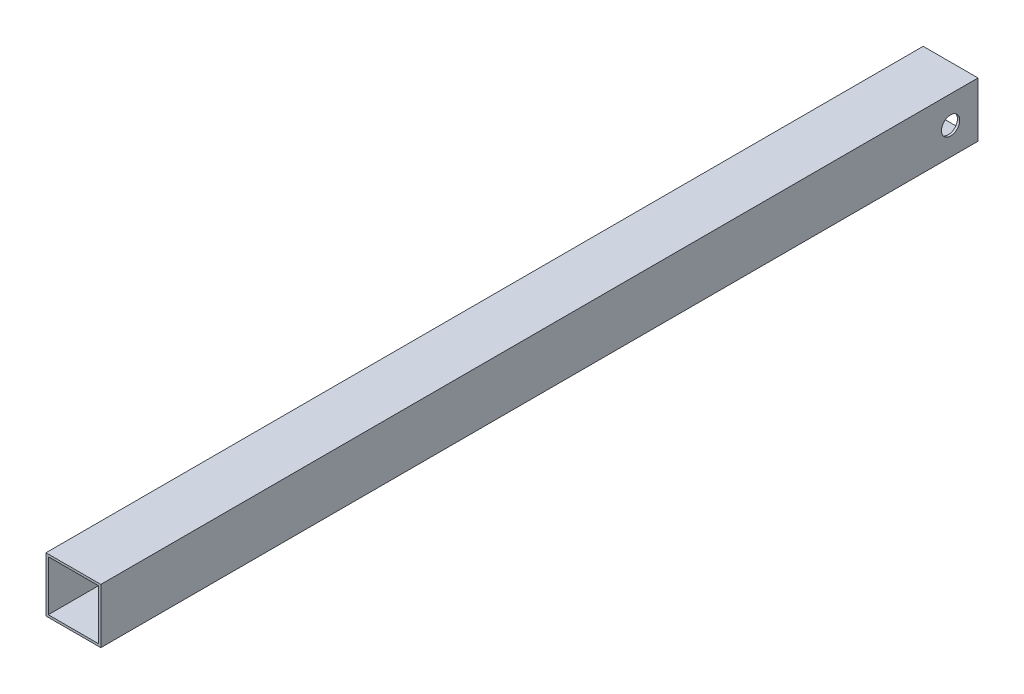
ISO-10303-21;
HEADER;
FILE_DESCRIPTION(('STEP AP214'),'2;1');
FILE_NAME('part.step','',(''),(''),'','','');
FILE_SCHEMA(('AUTOMOTIVE_DESIGN { 1 0 10303 214 1 1 1 1 }'));
ENDSEC;
DATA;
#1=APPLICATION_CONTEXT('core data for automotive mechanical design processes');
#2=APPLICATION_PROTOCOL_DEFINITION('international standard','automotive_design',2000,#1);
#3=PRODUCT_CONTEXT('',#1,'mechanical');
#4=PRODUCT('Part','Part','',(#3));
#5=PRODUCT_RELATED_PRODUCT_CATEGORY('part','',(#4));
#6=PRODUCT_DEFINITION_FORMATION('','',#4);
#7=PRODUCT_DEFINITION_CONTEXT('part definition',#1,'design');
#8=PRODUCT_DEFINITION('design','',#6,#7);
#9=PRODUCT_DEFINITION_SHAPE('','',#8);
#10=(LENGTH_UNIT() NAMED_UNIT(*) SI_UNIT(.MILLI.,.METRE.));
#11=(NAMED_UNIT(*) PLANE_ANGLE_UNIT() SI_UNIT($,.RADIAN.));
#12=(NAMED_UNIT(*) SI_UNIT($,.STERADIAN.) SOLID_ANGLE_UNIT());
#13=UNCERTAINTY_MEASURE_WITH_UNIT(LENGTH_MEASURE(1.E-05),#10,'distance_accuracy_value','');
#14=(GEOMETRIC_REPRESENTATION_CONTEXT(3) GLOBAL_UNCERTAINTY_ASSIGNED_CONTEXT((#13)) GLOBAL_UNIT_ASSIGNED_CONTEXT((#10,
#11,#12)) REPRESENTATION_CONTEXT('',''));
#15=CARTESIAN_POINT('',(0.,0.,0.));
#16=DIRECTION('',(0.,0.,1.));
#17=DIRECTION('',(1.,0.,0.));
#18=AXIS2_PLACEMENT_3D('',#15,#16,#17);
#19=CARTESIAN_POINT('',(0.,0.,609.6));
#20=DIRECTION('',(0.,0.,-1.));
#21=DIRECTION('',(-1.,0.,0.));
#22=AXIS2_PLACEMENT_3D('',#19,#20,#21);
#23=PLANE('',#22);
#24=DIRECTION('',(0.,-1.,0.));
#25=VECTOR('',#24,1.);
#26=CARTESIAN_POINT('',(0.,0.,609.6));
#27=LINE('',#26,#25);
#28=CARTESIAN_POINT('',(0.,38.1,609.6));
#29=VERTEX_POINT('',#28);
#30=CARTESIAN_POINT('',(0.,0.,609.6));
#31=VERTEX_POINT('',#30);
#32=EDGE_CURVE('E137',#29,#31,#27,.T.);
#33=ORIENTED_EDGE('',*,*,#32,.T.);
#34=DIRECTION('',(1.,0.,0.));
#35=VECTOR('',#34,1.);
#36=CARTESIAN_POINT('',(0.,0.,609.6));
#37=LINE('',#36,#35);
#38=CARTESIAN_POINT('',(38.1,0.,609.6));
#39=VERTEX_POINT('',#38);
#40=EDGE_CURVE('E140',#31,#39,#37,.T.);
#41=ORIENTED_EDGE('',*,*,#40,.T.);
#42=DIRECTION('',(0.,1.,0.));
#43=VECTOR('',#42,1.);
#44=CARTESIAN_POINT('',(38.1,0.,609.6));
#45=LINE('',#44,#43);
#46=CARTESIAN_POINT('',(38.1,38.1,609.6));
#47=VERTEX_POINT('',#46);
#48=EDGE_CURVE('E143',#39,#47,#45,.T.);
#49=ORIENTED_EDGE('',*,*,#48,.T.);
#50=DIRECTION('',(-1.,0.,0.));
#51=VECTOR('',#50,1.);
#52=CARTESIAN_POINT('',(0.,38.1,609.6));
#53=LINE('',#52,#51);
#54=EDGE_CURVE('E145',#47,#29,#53,.T.);
#55=ORIENTED_EDGE('',*,*,#54,.T.);
#56=EDGE_LOOP('',(#33,#41,#49,#55));
#57=FACE_BOUND('',#56,.T.);
#58=DIRECTION('',(0.,-1.,0.));
#59=VECTOR('',#58,1.);
#60=CARTESIAN_POINT('',(1.5875,1.5875,609.6));
#61=LINE('',#60,#59);
#62=CARTESIAN_POINT('',(1.5875,36.5125,609.6));
#63=VERTEX_POINT('',#62);
#64=CARTESIAN_POINT('',(1.5875,1.5875,609.6));
#65=VERTEX_POINT('',#64);
#66=EDGE_CURVE('E99',#63,#65,#61,.T.);
#67=ORIENTED_EDGE('',*,*,#66,.F.);
#68=DIRECTION('',(-1.,0.,0.));
#69=VECTOR('',#68,1.);
#70=CARTESIAN_POINT('',(1.5875,36.5125,609.6));
#71=LINE('',#70,#69);
#72=CARTESIAN_POINT('',(36.5125,36.5125,609.6));
#73=VERTEX_POINT('',#72);
#74=EDGE_CURVE('E121',#73,#63,#71,.T.);
#75=ORIENTED_EDGE('',*,*,#74,.F.);
#76=DIRECTION('',(0.,1.,0.));
#77=VECTOR('',#76,1.);
#78=CARTESIAN_POINT('',(36.5125,1.5875,609.6));
#79=LINE('',#78,#77);
#80=CARTESIAN_POINT('',(36.5125,1.5875,609.6));
#81=VERTEX_POINT('',#80);
#82=EDGE_CURVE('E119',#81,#73,#79,.T.);
#83=ORIENTED_EDGE('',*,*,#82,.F.);
#84=DIRECTION('',(1.,0.,0.));
#85=VECTOR('',#84,1.);
#86=CARTESIAN_POINT('',(1.5875,1.5875,609.6));
#87=LINE('',#86,#85);
#88=EDGE_CURVE('E107',#65,#81,#87,.T.);
#89=ORIENTED_EDGE('',*,*,#88,.F.);
#90=EDGE_LOOP('',(#67,#75,#83,#89));
#91=FACE_BOUND('',#90,.T.);
#92=ADVANCED_FACE('F33',(#57,#91),#23,.F.);
#93=CARTESIAN_POINT('',(0.,0.,0.));
#94=DIRECTION('',(0.,0.,-1.));
#95=DIRECTION('',(-1.,0.,0.));
#96=AXIS2_PLACEMENT_3D('',#93,#94,#95);
#97=PLANE('',#96);
#98=DIRECTION('',(0.,-1.,0.));
#99=VECTOR('',#98,1.);
#100=CARTESIAN_POINT('',(0.,0.,0.));
#101=LINE('',#100,#99);
#102=CARTESIAN_POINT('',(0.,38.1,0.));
#103=VERTEX_POINT('',#102);
#104=CARTESIAN_POINT('',(0.,0.,0.));
#105=VERTEX_POINT('',#104);
#106=EDGE_CURVE('E115',#103,#105,#101,.T.);
#107=ORIENTED_EDGE('',*,*,#106,.F.);
#108=DIRECTION('',(-1.,0.,0.));
#109=VECTOR('',#108,1.);
#110=CARTESIAN_POINT('',(0.,38.1,0.));
#111=LINE('',#110,#109);
#112=CARTESIAN_POINT('',(38.1,38.1,0.));
#113=VERTEX_POINT('',#112);
#114=EDGE_CURVE('E141',#113,#103,#111,.T.);
#115=ORIENTED_EDGE('',*,*,#114,.F.);
#116=DIRECTION('',(0.,1.,0.));
#117=VECTOR('',#116,1.);
#118=CARTESIAN_POINT('',(38.1,0.,0.));
#119=LINE('',#118,#117);
#120=CARTESIAN_POINT('',(38.1,0.,0.));
#121=VERTEX_POINT('',#120);
#122=EDGE_CURVE('E152',#121,#113,#119,.T.);
#123=ORIENTED_EDGE('',*,*,#122,.F.);
#124=DIRECTION('',(1.,0.,0.));
#125=VECTOR('',#124,1.);
#126=CARTESIAN_POINT('',(0.,0.,0.));
#127=LINE('',#126,#125);
#128=EDGE_CURVE('E150',#105,#121,#127,.T.);
#129=ORIENTED_EDGE('',*,*,#128,.F.);
#130=EDGE_LOOP('',(#107,#115,#123,#129));
#131=FACE_BOUND('',#130,.T.);
#132=DIRECTION('',(-1.,0.,0.));
#133=VECTOR('',#132,1.);
#134=CARTESIAN_POINT('',(1.5875,36.5125,0.));
#135=LINE('',#134,#133);
#136=CARTESIAN_POINT('',(36.5125,36.5125,0.));
#137=VERTEX_POINT('',#136);
#138=CARTESIAN_POINT('',(1.5875,36.5125,0.));
#139=VERTEX_POINT('',#138);
#140=EDGE_CURVE('E108',#137,#139,#135,.T.);
#141=ORIENTED_EDGE('',*,*,#140,.T.);
#142=DIRECTION('',(0.,-1.,0.));
#143=VECTOR('',#142,1.);
#144=CARTESIAN_POINT('',(1.5875,1.5875,0.));
#145=LINE('',#144,#143);
#146=CARTESIAN_POINT('',(1.5875,1.5875,0.));
#147=VERTEX_POINT('',#146);
#148=EDGE_CURVE('E57',#139,#147,#145,.T.);
#149=ORIENTED_EDGE('',*,*,#148,.T.);
#150=DIRECTION('',(1.,0.,0.));
#151=VECTOR('',#150,1.);
#152=CARTESIAN_POINT('',(1.5875,1.5875,0.));
#153=LINE('',#152,#151);
#154=CARTESIAN_POINT('',(36.5125,1.5875,0.));
#155=VERTEX_POINT('',#154);
#156=EDGE_CURVE('E114',#147,#155,#153,.T.);
#157=ORIENTED_EDGE('',*,*,#156,.T.);
#158=DIRECTION('',(0.,1.,0.));
#159=VECTOR('',#158,1.);
#160=CARTESIAN_POINT('',(36.5125,1.5875,0.));
#161=LINE('',#160,#159);
#162=EDGE_CURVE('E129',#155,#137,#161,.T.);
#163=ORIENTED_EDGE('',*,*,#162,.T.);
#164=EDGE_LOOP('',(#141,#149,#157,#163));
#165=FACE_BOUND('',#164,.T.);
#166=ADVANCED_FACE('F171',(#131,#165),#97,.T.);
#167=CARTESIAN_POINT('',(0.,0.,609.6));
#168=DIRECTION('',(1.,0.,0.));
#169=DIRECTION('',(0.,0.,-1.));
#170=AXIS2_PLACEMENT_3D('',#167,#168,#169);
#171=PLANE('',#170);
#172=CARTESIAN_POINT('',(0.,19.05,19.05));
#173=DIRECTION('',(-1.,0.,0.));
#174=DIRECTION('',(0.,0.,1.));
#175=AXIS2_PLACEMENT_3D('',#172,#173,#174);
#176=CIRCLE('',#175,6.35);
#177=CARTESIAN_POINT('',(0.,19.05,25.4));
#178=VERTEX_POINT('',#177);
#179=EDGE_CURVE('E216',#178,#178,#176,.T.);
#180=ORIENTED_EDGE('',*,*,#179,.F.);
#181=EDGE_LOOP('',(#180));
#182=FACE_BOUND('',#181,.T.);
#183=ORIENTED_EDGE('',*,*,#106,.T.);
#184=DIRECTION('',(0.,0.,-1.));
#185=VECTOR('',#184,1.);
#186=CARTESIAN_POINT('',(0.,0.,609.6));
#187=LINE('',#186,#185);
#188=EDGE_CURVE('E11',#31,#105,#187,.T.);
#189=ORIENTED_EDGE('',*,*,#188,.F.);
#190=ORIENTED_EDGE('',*,*,#32,.F.);
#191=DIRECTION('',(0.,0.,-1.));
#192=VECTOR('',#191,1.);
#193=CARTESIAN_POINT('',(0.,38.1,609.6));
#194=LINE('',#193,#192);
#195=EDGE_CURVE('E147',#29,#103,#194,.T.);
#196=ORIENTED_EDGE('',*,*,#195,.T.);
#197=EDGE_LOOP('',(#183,#189,#190,#196));
#198=FACE_BOUND('',#197,.T.);
#199=ADVANCED_FACE('F35',(#182,#198),#171,.F.);
#200=CARTESIAN_POINT('',(0.,0.,609.6));
#201=DIRECTION('',(0.,1.,0.));
#202=DIRECTION('',(0.,0.,1.));
#203=AXIS2_PLACEMENT_3D('',#200,#201,#202);
#204=PLANE('',#203);
#205=ORIENTED_EDGE('',*,*,#128,.T.);
#206=DIRECTION('',(0.,0.,-1.));
#207=VECTOR('',#206,1.);
#208=CARTESIAN_POINT('',(38.1,0.,609.6));
#209=LINE('',#208,#207);
#210=EDGE_CURVE('E42',#39,#121,#209,.T.);
#211=ORIENTED_EDGE('',*,*,#210,.F.);
#212=ORIENTED_EDGE('',*,*,#40,.F.);
#213=ORIENTED_EDGE('',*,*,#188,.T.);
#214=EDGE_LOOP('',(#205,#211,#212,#213));
#215=FACE_BOUND('',#214,.T.);
#216=ADVANCED_FACE('F181',(#215),#204,.F.);
#217=CARTESIAN_POINT('',(38.1,0.,609.6));
#218=DIRECTION('',(-1.,0.,0.));
#219=DIRECTION('',(0.,0.,1.));
#220=AXIS2_PLACEMENT_3D('',#217,#218,#219);
#221=PLANE('',#220);
#222=CARTESIAN_POINT('',(38.1,19.05,19.05));
#223=DIRECTION('',(-1.,0.,0.));
#224=DIRECTION('',(0.,0.,1.));
#225=AXIS2_PLACEMENT_3D('',#222,#223,#224);
#226=CIRCLE('',#225,6.34999999999999);
#227=CARTESIAN_POINT('',(38.1,19.05,25.4));
#228=VERTEX_POINT('',#227);
#229=EDGE_CURVE('E212',#228,#228,#226,.T.);
#230=ORIENTED_EDGE('',*,*,#229,.T.);
#231=EDGE_LOOP('',(#230));
#232=FACE_BOUND('',#231,.T.);
#233=ORIENTED_EDGE('',*,*,#122,.T.);
#234=DIRECTION('',(0.,0.,-1.));
#235=VECTOR('',#234,1.);
#236=CARTESIAN_POINT('',(38.1,38.1,609.6));
#237=LINE('',#236,#235);
#238=EDGE_CURVE('E157',#47,#113,#237,.T.);
#239=ORIENTED_EDGE('',*,*,#238,.F.);
#240=ORIENTED_EDGE('',*,*,#48,.F.);
#241=ORIENTED_EDGE('',*,*,#210,.T.);
#242=EDGE_LOOP('',(#233,#239,#240,#241));
#243=FACE_BOUND('',#242,.T.);
#244=ADVANCED_FACE('F165',(#232,#243),#221,.F.);
#245=CARTESIAN_POINT('',(0.,38.1,609.6));
#246=DIRECTION('',(0.,-1.,0.));
#247=DIRECTION('',(0.,0.,-1.));
#248=AXIS2_PLACEMENT_3D('',#245,#246,#247);
#249=PLANE('',#248);
#250=ORIENTED_EDGE('',*,*,#114,.T.);
#251=ORIENTED_EDGE('',*,*,#195,.F.);
#252=ORIENTED_EDGE('',*,*,#54,.F.);
#253=ORIENTED_EDGE('',*,*,#238,.T.);
#254=EDGE_LOOP('',(#250,#251,#252,#253));
#255=FACE_BOUND('',#254,.T.);
#256=ADVANCED_FACE('F175',(#255),#249,.F.);
#257=CARTESIAN_POINT('',(1.5875,1.5875,609.6));
#258=DIRECTION('',(1.,0.,0.));
#259=DIRECTION('',(0.,1.,0.));
#260=AXIS2_PLACEMENT_3D('',#257,#258,#259);
#261=PLANE('',#260);
#262=CARTESIAN_POINT('',(1.5875,19.05,19.05));
#263=DIRECTION('',(1.,0.,0.));
#264=DIRECTION('',(0.,1.,0.));
#265=AXIS2_PLACEMENT_3D('',#262,#263,#264);
#266=CIRCLE('',#265,6.34999999999999);
#267=CARTESIAN_POINT('',(1.5875,25.4,19.05));
#268=VERTEX_POINT('',#267);
#269=EDGE_CURVE('E127',#268,#268,#266,.T.);
#270=ORIENTED_EDGE('',*,*,#269,.F.);
#271=EDGE_LOOP('',(#270));
#272=FACE_BOUND('',#271,.T.);
#273=ORIENTED_EDGE('',*,*,#148,.F.);
#274=DIRECTION('',(0.,0.,-1.));
#275=VECTOR('',#274,1.);
#276=CARTESIAN_POINT('',(1.5875,36.5125,609.6));
#277=LINE('',#276,#275);
#278=EDGE_CURVE('E103',#63,#139,#277,.T.);
#279=ORIENTED_EDGE('',*,*,#278,.F.);
#280=ORIENTED_EDGE('',*,*,#66,.T.);
#281=DIRECTION('',(0.,0.,-1.));
#282=VECTOR('',#281,1.);
#283=CARTESIAN_POINT('',(1.5875,1.5875,609.6));
#284=LINE('',#283,#282);
#285=EDGE_CURVE('E102',#65,#147,#284,.T.);
#286=ORIENTED_EDGE('',*,*,#285,.T.);
#287=EDGE_LOOP('',(#273,#279,#280,#286));
#288=FACE_BOUND('',#287,.T.);
#289=ADVANCED_FACE('F101',(#272,#288),#261,.T.);
#290=CARTESIAN_POINT('',(1.5875,1.5875,609.6));
#291=DIRECTION('',(0.,1.,0.));
#292=DIRECTION('',(0.,0.,1.));
#293=AXIS2_PLACEMENT_3D('',#290,#291,#292);
#294=PLANE('',#293);
#295=ORIENTED_EDGE('',*,*,#156,.F.);
#296=ORIENTED_EDGE('',*,*,#285,.F.);
#297=ORIENTED_EDGE('',*,*,#88,.T.);
#298=DIRECTION('',(0.,0.,-1.));
#299=VECTOR('',#298,1.);
#300=CARTESIAN_POINT('',(36.5125,1.5875,609.6));
#301=LINE('',#300,#299);
#302=EDGE_CURVE('E116',#81,#155,#301,.T.);
#303=ORIENTED_EDGE('',*,*,#302,.T.);
#304=EDGE_LOOP('',(#295,#296,#297,#303));
#305=FACE_BOUND('',#304,.T.);
#306=ADVANCED_FACE('F111',(#305),#294,.T.);
#307=CARTESIAN_POINT('',(36.5125,1.5875,609.6));
#308=DIRECTION('',(-1.,0.,0.));
#309=DIRECTION('',(0.,0.,1.));
#310=AXIS2_PLACEMENT_3D('',#307,#308,#309);
#311=PLANE('',#310);
#312=CARTESIAN_POINT('',(36.5125,19.05,19.05));
#313=DIRECTION('',(-1.,0.,0.));
#314=DIRECTION('',(0.,0.,1.));
#315=AXIS2_PLACEMENT_3D('',#312,#313,#314);
#316=CIRCLE('',#315,6.34999999999999);
#317=CARTESIAN_POINT('',(36.5125,19.05,25.4));
#318=VERTEX_POINT('',#317);
#319=EDGE_CURVE('E37',#318,#318,#316,.T.);
#320=ORIENTED_EDGE('',*,*,#319,.F.);
#321=EDGE_LOOP('',(#320));
#322=FACE_BOUND('',#321,.T.);
#323=ORIENTED_EDGE('',*,*,#162,.F.);
#324=ORIENTED_EDGE('',*,*,#302,.F.);
#325=ORIENTED_EDGE('',*,*,#82,.T.);
#326=DIRECTION('',(0.,0.,-1.));
#327=VECTOR('',#326,1.);
#328=CARTESIAN_POINT('',(36.5125,36.5125,609.6));
#329=LINE('',#328,#327);
#330=EDGE_CURVE('E49',#73,#137,#329,.T.);
#331=ORIENTED_EDGE('',*,*,#330,.T.);
#332=EDGE_LOOP('',(#323,#324,#325,#331));
#333=FACE_BOUND('',#332,.T.);
#334=ADVANCED_FACE('F207',(#322,#333),#311,.T.);
#335=CARTESIAN_POINT('',(1.5875,36.5125,609.6));
#336=DIRECTION('',(0.,-1.,0.));
#337=DIRECTION('',(0.,0.,-1.));
#338=AXIS2_PLACEMENT_3D('',#335,#336,#337);
#339=PLANE('',#338);
#340=ORIENTED_EDGE('',*,*,#140,.F.);
#341=ORIENTED_EDGE('',*,*,#330,.F.);
#342=ORIENTED_EDGE('',*,*,#74,.T.);
#343=ORIENTED_EDGE('',*,*,#278,.T.);
#344=EDGE_LOOP('',(#340,#341,#342,#343));
#345=FACE_BOUND('',#344,.T.);
#346=ADVANCED_FACE('F227',(#345),#339,.T.);
#347=CARTESIAN_POINT('',(0.,19.05,19.05));
#348=DIRECTION('',(-1.,0.,0.));
#349=DIRECTION('',(0.,0.,1.));
#350=AXIS2_PLACEMENT_3D('',#347,#348,#349);
#351=CYLINDRICAL_SURFACE('',#350,6.34999999999999);
#352=ORIENTED_EDGE('',*,*,#319,.T.);
#353=EDGE_LOOP('',(#352));
#354=FACE_BOUND('',#353,.T.);
#355=ORIENTED_EDGE('',*,*,#229,.F.);
#356=EDGE_LOOP('',(#355));
#357=FACE_BOUND('',#356,.T.);
#358=ADVANCED_FACE('F222',(#354,#357),#351,.F.);
#359=ORIENTED_EDGE('',*,*,#269,.T.);
#360=EDGE_LOOP('',(#359));
#361=FACE_BOUND('',#360,.T.);
#362=ORIENTED_EDGE('',*,*,#179,.T.);
#363=EDGE_LOOP('',(#362));
#364=FACE_BOUND('',#363,.T.);
#365=ADVANCED_FACE('F220',(#361,#364),#351,.F.);
#366=CLOSED_SHELL('',(#92,#166,#199,#216,#244,#256,#289,#306,#334,#346,#358,#365));
#367=MANIFOLD_SOLID_BREP('B2',#366);
#368=ADVANCED_BREP_SHAPE_REPRESENTATION('',(#18,#367),#14);
#369=SHAPE_DEFINITION_REPRESENTATION(#9,#368);
ENDSEC;
END-ISO-10303-21;
